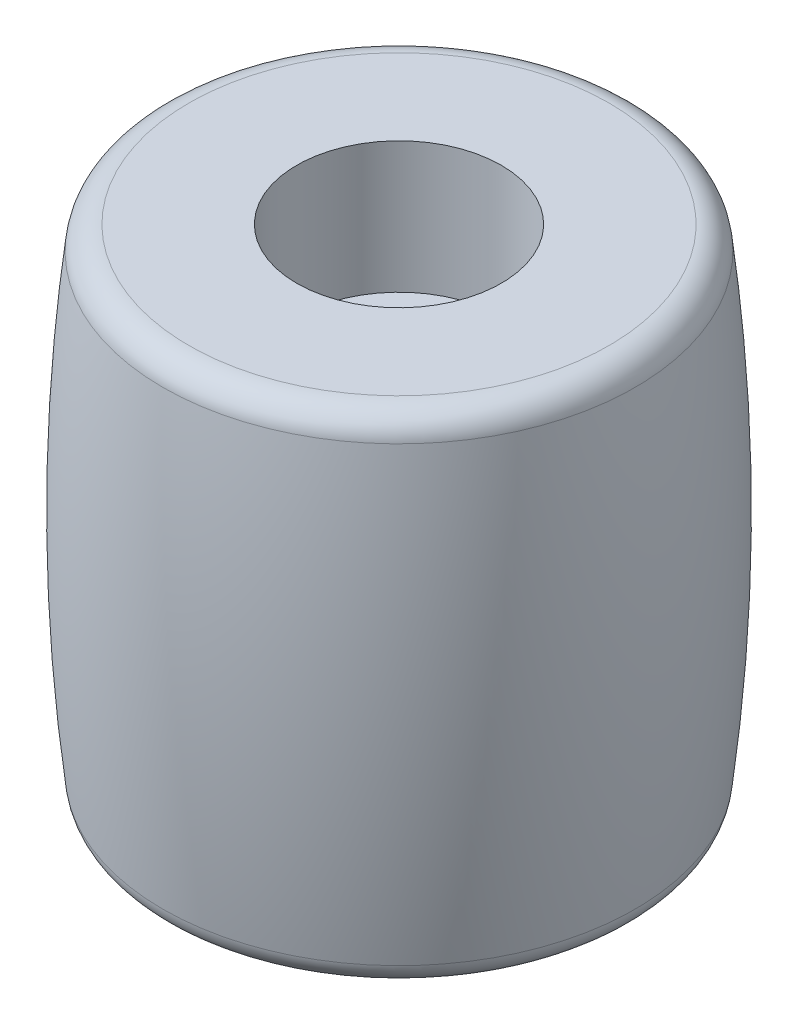
ISO-10303-21;
HEADER;
FILE_DESCRIPTION(('STEP AP214'),'2;1');
FILE_NAME('part.step','',(''),(''),'','','');
FILE_SCHEMA(('AUTOMOTIVE_DESIGN { 1 0 10303 214 1 1 1 1 }'));
ENDSEC;
DATA;
#1=APPLICATION_CONTEXT('core data for automotive mechanical design processes');
#2=APPLICATION_PROTOCOL_DEFINITION('international standard','automotive_design',2000,#1);
#3=PRODUCT_CONTEXT('',#1,'mechanical');
#4=PRODUCT('Part','Part','',(#3));
#5=PRODUCT_RELATED_PRODUCT_CATEGORY('part','',(#4));
#6=PRODUCT_DEFINITION_FORMATION('','',#4);
#7=PRODUCT_DEFINITION_CONTEXT('part definition',#1,'design');
#8=PRODUCT_DEFINITION('design','',#6,#7);
#9=PRODUCT_DEFINITION_SHAPE('','',#8);
#10=(LENGTH_UNIT() NAMED_UNIT(*) SI_UNIT(.MILLI.,.METRE.));
#11=(NAMED_UNIT(*) PLANE_ANGLE_UNIT() SI_UNIT($,.RADIAN.));
#12=(NAMED_UNIT(*) SI_UNIT($,.STERADIAN.) SOLID_ANGLE_UNIT());
#13=UNCERTAINTY_MEASURE_WITH_UNIT(LENGTH_MEASURE(1.E-05),#10,'distance_accuracy_value','');
#14=(GEOMETRIC_REPRESENTATION_CONTEXT(3) GLOBAL_UNCERTAINTY_ASSIGNED_CONTEXT((#13)) GLOBAL_UNIT_ASSIGNED_CONTEXT((#10,
#11,#12)) REPRESENTATION_CONTEXT('',''));
#15=CARTESIAN_POINT('',(0.,0.,0.));
#16=DIRECTION('',(0.,0.,1.));
#17=DIRECTION('',(1.,0.,0.));
#18=AXIS2_PLACEMENT_3D('',#15,#16,#17);
#19=CARTESIAN_POINT('',(0.,9.5,0.));
#20=DIRECTION('',(0.,-1.,0.));
#21=DIRECTION('',(0.,0.,-1.));
#22=AXIS2_PLACEMENT_3D('',#19,#20,#21);
#23=PLANE('',#22);
#24=CARTESIAN_POINT('',(0.,9.5,0.));
#25=DIRECTION('',(0.,-1.,0.));
#26=DIRECTION('',(0.,0.,-1.));
#27=AXIS2_PLACEMENT_3D('',#24,#25,#26);
#28=CIRCLE('',#27,8.01020337340935);
#29=CARTESIAN_POINT('',(0.,9.5,-8.01020337340935));
#30=VERTEX_POINT('',#29);
#31=EDGE_CURVE('E10',#30,#30,#28,.F.);
#32=ORIENTED_EDGE('',*,*,#31,.T.);
#33=EDGE_LOOP('',(#32));
#34=FACE_BOUND('',#33,.T.);
#35=CARTESIAN_POINT('',(0.,9.5,0.));
#36=DIRECTION('',(0.,-1.,0.));
#37=DIRECTION('',(0.,0.,-1.));
#38=AXIS2_PLACEMENT_3D('',#35,#36,#37);
#39=CIRCLE('',#38,3.9);
#40=CARTESIAN_POINT('',(0.,9.5,-3.9));
#41=VERTEX_POINT('',#40);
#42=EDGE_CURVE('E88',#41,#41,#39,.T.);
#43=ORIENTED_EDGE('',*,*,#42,.T.);
#44=EDGE_LOOP('',(#43));
#45=FACE_BOUND('',#44,.T.);
#46=ADVANCED_FACE('F42',(#34,#45),#23,.F.);
#47=CARTESIAN_POINT('',(0.,0.,0.));
#48=DIRECTION('',(0.,-1.,0.));
#49=DIRECTION('',(0.,0.,-1.));
#50=AXIS2_PLACEMENT_3D('',#47,#48,#49);
#51=DEGENERATE_TOROIDAL_SURFACE('',#50,65.5,75.,.F.);
#52=CARTESIAN_POINT('',(0.,-8.61486486486486,0.));
#53=DIRECTION('',(0.,1.,0.));
#54=DIRECTION('',(0.,0.,1.));
#55=AXIS2_PLACEMENT_3D('',#52,#53,#54);
#56=CIRCLE('',#55,9.00358450007705);
#57=CARTESIAN_POINT('',(0.,-8.61486486486486,9.00358450007705));
#58=VERTEX_POINT('',#57);
#59=EDGE_CURVE('E50',#58,#58,#56,.T.);
#60=ORIENTED_EDGE('',*,*,#59,.T.);
#61=EDGE_LOOP('',(#60));
#62=FACE_BOUND('',#61,.T.);
#63=CARTESIAN_POINT('',(0.,8.61486486486486,0.));
#64=DIRECTION('',(0.,-1.,0.));
#65=DIRECTION('',(0.,0.,-1.));
#66=AXIS2_PLACEMENT_3D('',#63,#64,#65);
#67=CIRCLE('',#66,9.00358450007705);
#68=CARTESIAN_POINT('',(0.,8.61486486486486,-9.00358450007705));
#69=VERTEX_POINT('',#68);
#70=EDGE_CURVE('E56',#69,#69,#67,.T.);
#71=ORIENTED_EDGE('',*,*,#70,.T.);
#72=EDGE_LOOP('',(#71));
#73=FACE_BOUND('',#72,.T.);
#74=ADVANCED_FACE('F120',(#62,#73),#51,.F.);
#75=CARTESIAN_POINT('',(0.,-9.5,0.));
#76=DIRECTION('',(0.,-1.,0.));
#77=DIRECTION('',(0.,0.,-1.));
#78=AXIS2_PLACEMENT_3D('',#75,#76,#77);
#79=PLANE('',#78);
#80=CARTESIAN_POINT('',(0.,-9.5,0.));
#81=DIRECTION('',(0.,-1.,0.));
#82=DIRECTION('',(0.,0.,-1.));
#83=AXIS2_PLACEMENT_3D('',#80,#81,#82);
#84=CIRCLE('',#83,8.01020337340935);
#85=CARTESIAN_POINT('',(0.,-9.5,-8.01020337340935));
#86=VERTEX_POINT('',#85);
#87=EDGE_CURVE('E62',#86,#86,#84,.T.);
#88=ORIENTED_EDGE('',*,*,#87,.T.);
#89=EDGE_LOOP('',(#88));
#90=FACE_BOUND('',#89,.T.);
#91=CARTESIAN_POINT('',(0.,-9.5,0.));
#92=DIRECTION('',(0.,-1.,0.));
#93=DIRECTION('',(0.,0.,-1.));
#94=AXIS2_PLACEMENT_3D('',#91,#92,#93);
#95=CIRCLE('',#94,3.9);
#96=CARTESIAN_POINT('',(0.,-9.5,-3.9));
#97=VERTEX_POINT('',#96);
#98=EDGE_CURVE('E68',#97,#97,#95,.T.);
#99=ORIENTED_EDGE('',*,*,#98,.F.);
#100=EDGE_LOOP('',(#99));
#101=FACE_BOUND('',#100,.T.);
#102=ADVANCED_FACE('F125',(#90,#101),#79,.T.);
#103=CARTESIAN_POINT('',(0.,0.,0.));
#104=DIRECTION('',(0.,-1.,0.));
#105=DIRECTION('',(0.,0.,-1.));
#106=AXIS2_PLACEMENT_3D('',#103,#104,#105);
#107=CYLINDRICAL_SURFACE('',#106,3.9);
#108=ORIENTED_EDGE('',*,*,#98,.T.);
#109=EDGE_LOOP('',(#108));
#110=FACE_BOUND('',#109,.T.);
#111=CARTESIAN_POINT('',(0.,-4.5,0.));
#112=DIRECTION('',(0.,-1.,0.));
#113=DIRECTION('',(0.,0.,-1.));
#114=AXIS2_PLACEMENT_3D('',#111,#112,#113);
#115=CIRCLE('',#114,3.9);
#116=CARTESIAN_POINT('',(0.,-4.5,-3.9));
#117=VERTEX_POINT('',#116);
#118=EDGE_CURVE('E72',#117,#117,#115,.T.);
#119=ORIENTED_EDGE('',*,*,#118,.F.);
#120=EDGE_LOOP('',(#119));
#121=FACE_BOUND('',#120,.T.);
#122=ADVANCED_FACE('F116',(#110,#121),#107,.F.);
#123=CARTESIAN_POINT('',(0.,-4.5,0.));
#124=DIRECTION('',(0.,-1.,0.));
#125=DIRECTION('',(0.,0.,-1.));
#126=AXIS2_PLACEMENT_3D('',#123,#124,#125);
#127=PLANE('',#126);
#128=ORIENTED_EDGE('',*,*,#118,.T.);
#129=EDGE_LOOP('',(#128));
#130=FACE_BOUND('',#129,.T.);
#131=CARTESIAN_POINT('',(0.,-4.5,0.));
#132=DIRECTION('',(0.,-1.,0.));
#133=DIRECTION('',(0.,0.,-1.));
#134=AXIS2_PLACEMENT_3D('',#131,#132,#133);
#135=CIRCLE('',#134,2.5);
#136=CARTESIAN_POINT('',(0.,-4.5,-2.5));
#137=VERTEX_POINT('',#136);
#138=EDGE_CURVE('E76',#137,#137,#135,.T.);
#139=ORIENTED_EDGE('',*,*,#138,.F.);
#140=EDGE_LOOP('',(#139));
#141=FACE_BOUND('',#140,.T.);
#142=ADVANCED_FACE('F110',(#130,#141),#127,.T.);
#143=CARTESIAN_POINT('',(0.,0.,0.));
#144=DIRECTION('',(0.,-1.,0.));
#145=DIRECTION('',(0.,0.,-1.));
#146=AXIS2_PLACEMENT_3D('',#143,#144,#145);
#147=CYLINDRICAL_SURFACE('',#146,2.5);
#148=ORIENTED_EDGE('',*,*,#138,.T.);
#149=EDGE_LOOP('',(#148));
#150=FACE_BOUND('',#149,.T.);
#151=CARTESIAN_POINT('',(0.,4.5,0.));
#152=DIRECTION('',(0.,-1.,0.));
#153=DIRECTION('',(0.,0.,-1.));
#154=AXIS2_PLACEMENT_3D('',#151,#152,#153);
#155=CIRCLE('',#154,2.5);
#156=CARTESIAN_POINT('',(0.,4.5,-2.5));
#157=VERTEX_POINT('',#156);
#158=EDGE_CURVE('E80',#157,#157,#155,.T.);
#159=ORIENTED_EDGE('',*,*,#158,.F.);
#160=EDGE_LOOP('',(#159));
#161=FACE_BOUND('',#160,.T.);
#162=ADVANCED_FACE('F105',(#150,#161),#147,.F.);
#163=CARTESIAN_POINT('',(0.,4.5,0.));
#164=DIRECTION('',(0.,-1.,0.));
#165=DIRECTION('',(0.,0.,-1.));
#166=AXIS2_PLACEMENT_3D('',#163,#164,#165);
#167=PLANE('',#166);
#168=CARTESIAN_POINT('',(0.,4.5,0.));
#169=DIRECTION('',(0.,-1.,0.));
#170=DIRECTION('',(0.,0.,-1.));
#171=AXIS2_PLACEMENT_3D('',#168,#169,#170);
#172=CIRCLE('',#171,3.9);
#173=CARTESIAN_POINT('',(0.,4.5,-3.9));
#174=VERTEX_POINT('',#173);
#175=EDGE_CURVE('E84',#174,#174,#172,.T.);
#176=ORIENTED_EDGE('',*,*,#175,.F.);
#177=EDGE_LOOP('',(#176));
#178=FACE_BOUND('',#177,.T.);
#179=ORIENTED_EDGE('',*,*,#158,.T.);
#180=EDGE_LOOP('',(#179));
#181=FACE_BOUND('',#180,.T.);
#182=ADVANCED_FACE('F99',(#178,#181),#167,.F.);
#183=CARTESIAN_POINT('',(0.,0.,0.));
#184=DIRECTION('',(0.,-1.,0.));
#185=DIRECTION('',(0.,0.,-1.));
#186=AXIS2_PLACEMENT_3D('',#183,#184,#185);
#187=CYLINDRICAL_SURFACE('',#186,3.9);
#188=ORIENTED_EDGE('',*,*,#42,.F.);
#189=EDGE_LOOP('',(#188));
#190=FACE_BOUND('',#189,.T.);
#191=ORIENTED_EDGE('',*,*,#175,.T.);
#192=EDGE_LOOP('',(#191));
#193=FACE_BOUND('',#192,.T.);
#194=ADVANCED_FACE('F95',(#190,#193),#187,.F.);
#195=CARTESIAN_POINT('',(0.,-8.5,0.));
#196=DIRECTION('',(0.,-1.,0.));
#197=DIRECTION('',(0.,0.,-1.));
#198=AXIS2_PLACEMENT_3D('',#195,#196,#197);
#199=TOROIDAL_SURFACE('',#198,8.01020337340935,1.);
#200=ORIENTED_EDGE('',*,*,#59,.F.);
#201=EDGE_LOOP('',(#200));
#202=FACE_BOUND('',#201,.T.);
#203=ORIENTED_EDGE('',*,*,#87,.F.);
#204=EDGE_LOOP('',(#203));
#205=FACE_BOUND('',#204,.T.);
#206=ADVANCED_FACE('F98',(#202,#205),#199,.T.);
#207=CARTESIAN_POINT('',(0.,8.5,0.));
#208=DIRECTION('',(0.,-1.,0.));
#209=DIRECTION('',(0.,0.,-1.));
#210=AXIS2_PLACEMENT_3D('',#207,#208,#209);
#211=TOROIDAL_SURFACE('',#210,8.01020337340935,1.);
#212=ORIENTED_EDGE('',*,*,#31,.F.);
#213=EDGE_LOOP('',(#212));
#214=FACE_BOUND('',#213,.T.);
#215=ORIENTED_EDGE('',*,*,#70,.F.);
#216=EDGE_LOOP('',(#215));
#217=FACE_BOUND('',#216,.T.);
#218=ADVANCED_FACE('F44',(#214,#217),#211,.T.);
#219=CLOSED_SHELL('',(#46,#74,#102,#122,#142,#162,#182,#194,#206,#218));
#220=MANIFOLD_SOLID_BREP('B2',#219);
#221=ADVANCED_BREP_SHAPE_REPRESENTATION('',(#18,#220),#14);
#222=SHAPE_DEFINITION_REPRESENTATION(#9,#221);
ENDSEC;
END-ISO-10303-21;
